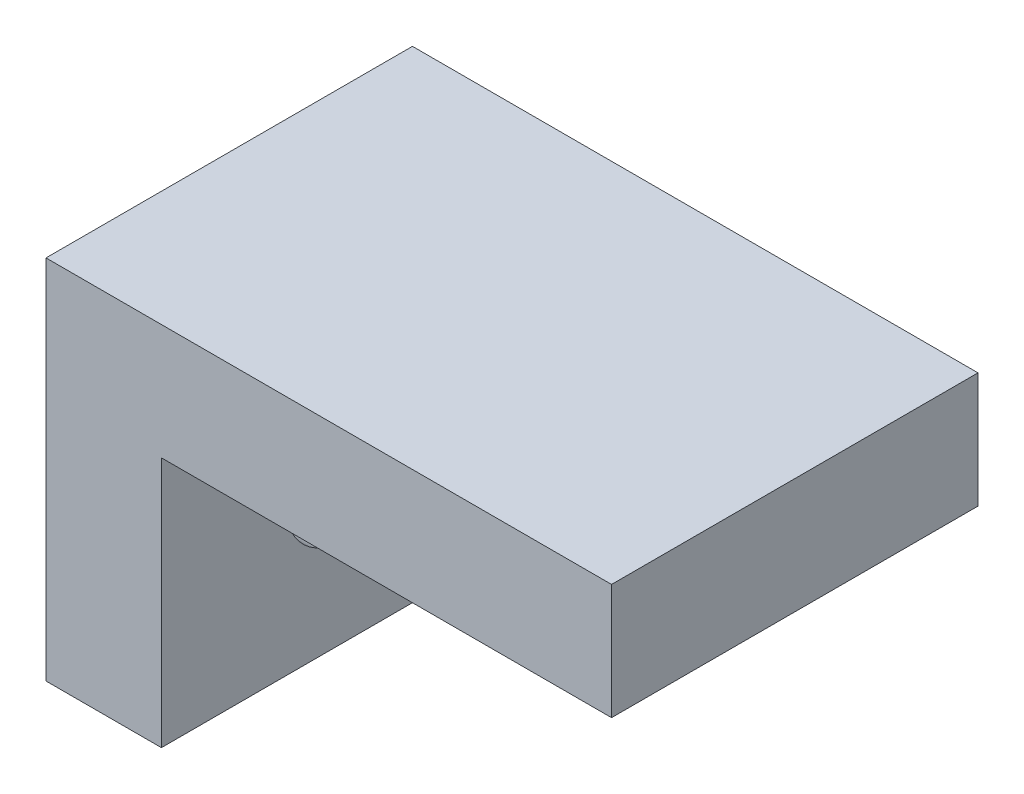
ISO-10303-21;
HEADER;
FILE_DESCRIPTION(('STEP AP214'),'2;1');
FILE_NAME('part.step','',(''),(''),'','','');
FILE_SCHEMA(('AUTOMOTIVE_DESIGN { 1 0 10303 214 1 1 1 1 }'));
ENDSEC;
DATA;
#1=APPLICATION_CONTEXT('core data for automotive mechanical design processes');
#2=APPLICATION_PROTOCOL_DEFINITION('international standard','automotive_design',2000,#1);
#3=PRODUCT_CONTEXT('',#1,'mechanical');
#4=PRODUCT('Part','Part','',(#3));
#5=PRODUCT_RELATED_PRODUCT_CATEGORY('part','',(#4));
#6=PRODUCT_DEFINITION_FORMATION('','',#4);
#7=PRODUCT_DEFINITION_CONTEXT('part definition',#1,'design');
#8=PRODUCT_DEFINITION('design','',#6,#7);
#9=PRODUCT_DEFINITION_SHAPE('','',#8);
#10=(LENGTH_UNIT() NAMED_UNIT(*) SI_UNIT(.MILLI.,.METRE.));
#11=(NAMED_UNIT(*) PLANE_ANGLE_UNIT() SI_UNIT($,.RADIAN.));
#12=(NAMED_UNIT(*) SI_UNIT($,.STERADIAN.) SOLID_ANGLE_UNIT());
#13=UNCERTAINTY_MEASURE_WITH_UNIT(LENGTH_MEASURE(1.E-05),#10,'distance_accuracy_value','');
#14=(GEOMETRIC_REPRESENTATION_CONTEXT(3) GLOBAL_UNCERTAINTY_ASSIGNED_CONTEXT((#13)) GLOBAL_UNIT_ASSIGNED_CONTEXT((#10,
#11,#12)) REPRESENTATION_CONTEXT('',''));
#15=CARTESIAN_POINT('',(0.,0.,0.));
#16=DIRECTION('',(0.,0.,1.));
#17=DIRECTION('',(1.,0.,0.));
#18=AXIS2_PLACEMENT_3D('',#15,#16,#17);
#19=CARTESIAN_POINT('',(2.5,2.9375,7.9375));
#20=DIRECTION('',(0.,1.,0.));
#21=DIRECTION('',(0.,0.,1.));
#22=AXIS2_PLACEMENT_3D('',#19,#20,#21);
#23=PLANE('',#22);
#24=DIRECTION('',(1.,0.,0.));
#25=VECTOR('',#24,1.);
#26=CARTESIAN_POINT('',(2.5,2.9375,-7.9375));
#27=LINE('',#26,#25);
#28=CARTESIAN_POINT('',(2.5,2.9375,-7.9375));
#29=VERTEX_POINT('',#28);
#30=CARTESIAN_POINT('',(22.,2.9375,-7.9375));
#31=VERTEX_POINT('',#30);
#32=EDGE_CURVE('E138',#29,#31,#27,.T.);
#33=ORIENTED_EDGE('',*,*,#32,.T.);
#34=DIRECTION('',(0.,0.,-1.));
#35=VECTOR('',#34,1.);
#36=CARTESIAN_POINT('',(22.,2.9375,7.9375));
#37=LINE('',#36,#35);
#38=CARTESIAN_POINT('',(22.,2.9375,7.9375));
#39=VERTEX_POINT('',#38);
#40=EDGE_CURVE('E13',#39,#31,#37,.T.);
#41=ORIENTED_EDGE('',*,*,#40,.F.);
#42=DIRECTION('',(1.,0.,0.));
#43=VECTOR('',#42,1.);
#44=CARTESIAN_POINT('',(2.5,2.9375,7.9375));
#45=LINE('',#44,#43);
#46=CARTESIAN_POINT('',(2.5,2.9375,7.9375));
#47=VERTEX_POINT('',#46);
#48=EDGE_CURVE('E104',#47,#39,#45,.T.);
#49=ORIENTED_EDGE('',*,*,#48,.F.);
#50=DIRECTION('',(0.,0.,-1.));
#51=VECTOR('',#50,1.);
#52=CARTESIAN_POINT('',(2.5,2.9375,7.9375));
#53=LINE('',#52,#51);
#54=EDGE_CURVE('E72',#47,#29,#53,.T.);
#55=ORIENTED_EDGE('',*,*,#54,.T.);
#56=EDGE_LOOP('',(#33,#41,#49,#55));
#57=FACE_BOUND('',#56,.T.);
#58=ADVANCED_FACE('F56',(#57),#23,.F.);
#59=CARTESIAN_POINT('',(22.,7.93749999999999,7.9375));
#60=DIRECTION('',(1.,0.,0.));
#61=DIRECTION('',(0.,0.,-1.));
#62=AXIS2_PLACEMENT_3D('',#59,#60,#61);
#63=PLANE('',#62);
#64=DIRECTION('',(0.,-1.,0.));
#65=VECTOR('',#64,1.);
#66=CARTESIAN_POINT('',(22.,7.93749999999999,-7.9375));
#67=LINE('',#66,#65);
#68=CARTESIAN_POINT('',(22.,7.93749999999999,-7.9375));
#69=VERTEX_POINT('',#68);
#70=EDGE_CURVE('E140',#69,#31,#67,.T.);
#71=ORIENTED_EDGE('',*,*,#70,.F.);
#72=DIRECTION('',(0.,0.,-1.));
#73=VECTOR('',#72,1.);
#74=CARTESIAN_POINT('',(22.,7.93749999999999,7.9375));
#75=LINE('',#74,#73);
#76=CARTESIAN_POINT('',(22.,7.93749999999999,7.9375));
#77=VERTEX_POINT('',#76);
#78=EDGE_CURVE('E64',#77,#69,#75,.T.);
#79=ORIENTED_EDGE('',*,*,#78,.F.);
#80=DIRECTION('',(0.,-1.,0.));
#81=VECTOR('',#80,1.);
#82=CARTESIAN_POINT('',(22.,7.93749999999999,7.9375));
#83=LINE('',#82,#81);
#84=EDGE_CURVE('E182',#77,#39,#83,.T.);
#85=ORIENTED_EDGE('',*,*,#84,.T.);
#86=ORIENTED_EDGE('',*,*,#40,.T.);
#87=EDGE_LOOP('',(#71,#79,#85,#86));
#88=FACE_BOUND('',#87,.T.);
#89=ADVANCED_FACE('F161',(#88),#63,.T.);
#90=CARTESIAN_POINT('',(-2.5,7.93749999999999,7.9375));
#91=DIRECTION('',(0.,1.,0.));
#92=DIRECTION('',(0.,0.,1.));
#93=AXIS2_PLACEMENT_3D('',#90,#91,#92);
#94=PLANE('',#93);
#95=DIRECTION('',(1.,0.,0.));
#96=VECTOR('',#95,1.);
#97=CARTESIAN_POINT('',(-2.5,7.93749999999999,-7.9375));
#98=LINE('',#97,#96);
#99=CARTESIAN_POINT('',(-2.5,7.93749999999999,-7.9375));
#100=VERTEX_POINT('',#99);
#101=EDGE_CURVE('E144',#100,#69,#98,.T.);
#102=ORIENTED_EDGE('',*,*,#101,.F.);
#103=DIRECTION('',(0.,0.,-1.));
#104=VECTOR('',#103,1.);
#105=CARTESIAN_POINT('',(-2.5,7.93749999999999,7.9375));
#106=LINE('',#105,#104);
#107=CARTESIAN_POINT('',(-2.5,7.93749999999999,7.9375));
#108=VERTEX_POINT('',#107);
#109=EDGE_CURVE('E130',#108,#100,#106,.T.);
#110=ORIENTED_EDGE('',*,*,#109,.F.);
#111=DIRECTION('',(1.,0.,0.));
#112=VECTOR('',#111,1.);
#113=CARTESIAN_POINT('',(2.5,7.93749999999999,7.9375));
#114=LINE('',#113,#112);
#115=EDGE_CURVE('E119',#108,#77,#114,.T.);
#116=ORIENTED_EDGE('',*,*,#115,.T.);
#117=ORIENTED_EDGE('',*,*,#78,.T.);
#118=EDGE_LOOP('',(#102,#110,#116,#117));
#119=FACE_BOUND('',#118,.T.);
#120=ADVANCED_FACE('F158',(#119),#94,.T.);
#121=CARTESIAN_POINT('',(-2.5,7.93749999999999,7.9375));
#122=DIRECTION('',(1.,0.,0.));
#123=DIRECTION('',(0.,1.,0.));
#124=AXIS2_PLACEMENT_3D('',#121,#122,#123);
#125=PLANE('',#124);
#126=CARTESIAN_POINT('',(-2.5,-1.5625,0.));
#127=DIRECTION('',(1.,0.,0.));
#128=DIRECTION('',(0.,1.,0.));
#129=AXIS2_PLACEMENT_3D('',#126,#127,#128);
#130=CIRCLE('',#129,2.55269999999999);
#131=CARTESIAN_POINT('',(-2.5,0.990199999999993,0.));
#132=VERTEX_POINT('',#131);
#133=EDGE_CURVE('E141',#132,#132,#130,.T.);
#134=ORIENTED_EDGE('',*,*,#133,.T.);
#135=EDGE_LOOP('',(#134));
#136=FACE_BOUND('',#135,.T.);
#137=DIRECTION('',(0.,-1.,0.));
#138=VECTOR('',#137,1.);
#139=CARTESIAN_POINT('',(-2.5,7.93749999999999,-7.9375));
#140=LINE('',#139,#138);
#141=CARTESIAN_POINT('',(-2.5,-7.93750000000001,-7.9375));
#142=VERTEX_POINT('',#141);
#143=EDGE_CURVE('E127',#100,#142,#140,.T.);
#144=ORIENTED_EDGE('',*,*,#143,.T.);
#145=DIRECTION('',(0.,0.,-1.));
#146=VECTOR('',#145,1.);
#147=CARTESIAN_POINT('',(-2.5,-7.93750000000001,7.9375));
#148=LINE('',#147,#146);
#149=CARTESIAN_POINT('',(-2.5,-7.93750000000001,7.9375));
#150=VERTEX_POINT('',#149);
#151=EDGE_CURVE('E124',#150,#142,#148,.T.);
#152=ORIENTED_EDGE('',*,*,#151,.F.);
#153=DIRECTION('',(0.,-1.,0.));
#154=VECTOR('',#153,1.);
#155=CARTESIAN_POINT('',(-2.5,7.93749999999999,7.9375));
#156=LINE('',#155,#154);
#157=EDGE_CURVE('E113',#108,#150,#156,.T.);
#158=ORIENTED_EDGE('',*,*,#157,.F.);
#159=ORIENTED_EDGE('',*,*,#109,.T.);
#160=EDGE_LOOP('',(#144,#152,#158,#159));
#161=FACE_BOUND('',#160,.T.);
#162=ADVANCED_FACE('F125',(#136,#161),#125,.F.);
#163=CARTESIAN_POINT('',(-2.5,-7.93750000000001,7.9375));
#164=DIRECTION('',(0.,1.,0.));
#165=DIRECTION('',(0.,0.,1.));
#166=AXIS2_PLACEMENT_3D('',#163,#164,#165);
#167=PLANE('',#166);
#168=DIRECTION('',(1.,0.,0.));
#169=VECTOR('',#168,1.);
#170=CARTESIAN_POINT('',(-2.5,-7.93750000000001,-7.9375));
#171=LINE('',#170,#169);
#172=CARTESIAN_POINT('',(2.5,-7.93750000000001,-7.9375));
#173=VERTEX_POINT('',#172);
#174=EDGE_CURVE('E147',#142,#173,#171,.T.);
#175=ORIENTED_EDGE('',*,*,#174,.T.);
#176=DIRECTION('',(0.,0.,-1.));
#177=VECTOR('',#176,1.);
#178=CARTESIAN_POINT('',(2.5,-7.93750000000001,7.9375));
#179=LINE('',#178,#177);
#180=CARTESIAN_POINT('',(2.5,-7.93750000000001,7.9375));
#181=VERTEX_POINT('',#180);
#182=EDGE_CURVE('E92',#181,#173,#179,.T.);
#183=ORIENTED_EDGE('',*,*,#182,.F.);
#184=DIRECTION('',(1.,0.,0.));
#185=VECTOR('',#184,1.);
#186=CARTESIAN_POINT('',(-2.5,-7.93750000000001,7.9375));
#187=LINE('',#186,#185);
#188=EDGE_CURVE('E117',#150,#181,#187,.T.);
#189=ORIENTED_EDGE('',*,*,#188,.F.);
#190=ORIENTED_EDGE('',*,*,#151,.T.);
#191=EDGE_LOOP('',(#175,#183,#189,#190));
#192=FACE_BOUND('',#191,.T.);
#193=ADVANCED_FACE('F132',(#192),#167,.F.);
#194=CARTESIAN_POINT('',(2.5,2.9375,7.9375));
#195=DIRECTION('',(1.,0.,0.));
#196=DIRECTION('',(0.,1.,0.));
#197=AXIS2_PLACEMENT_3D('',#194,#195,#196);
#198=PLANE('',#197);
#199=CARTESIAN_POINT('',(2.5,-1.5625,0.));
#200=DIRECTION('',(1.,0.,0.));
#201=DIRECTION('',(0.,0.,-1.));
#202=AXIS2_PLACEMENT_3D('',#199,#200,#201);
#203=CIRCLE('',#202,2.55269999999999);
#204=CARTESIAN_POINT('',(2.5,-1.5625,-2.55269999999999));
#205=VERTEX_POINT('',#204);
#206=EDGE_CURVE('E188',#205,#205,#203,.T.);
#207=ORIENTED_EDGE('',*,*,#206,.F.);
#208=EDGE_LOOP('',(#207));
#209=FACE_BOUND('',#208,.T.);
#210=DIRECTION('',(0.,-1.,0.));
#211=VECTOR('',#210,1.);
#212=CARTESIAN_POINT('',(2.5,2.9375,-7.9375));
#213=LINE('',#212,#211);
#214=EDGE_CURVE('E149',#29,#173,#213,.T.);
#215=ORIENTED_EDGE('',*,*,#214,.F.);
#216=ORIENTED_EDGE('',*,*,#54,.F.);
#217=DIRECTION('',(0.,-1.,0.));
#218=VECTOR('',#217,1.);
#219=CARTESIAN_POINT('',(2.5,2.9375,7.9375));
#220=LINE('',#219,#218);
#221=EDGE_CURVE('E133',#47,#181,#220,.T.);
#222=ORIENTED_EDGE('',*,*,#221,.T.);
#223=ORIENTED_EDGE('',*,*,#182,.T.);
#224=EDGE_LOOP('',(#215,#216,#222,#223));
#225=FACE_BOUND('',#224,.T.);
#226=ADVANCED_FACE('F164',(#209,#225),#198,.T.);
#227=CARTESIAN_POINT('',(0.,0.,7.9375));
#228=DIRECTION('',(0.,0.,-1.));
#229=DIRECTION('',(-1.,0.,0.));
#230=AXIS2_PLACEMENT_3D('',#227,#228,#229);
#231=PLANE('',#230);
#232=ORIENTED_EDGE('',*,*,#48,.T.);
#233=ORIENTED_EDGE('',*,*,#84,.F.);
#234=ORIENTED_EDGE('',*,*,#115,.F.);
#235=ORIENTED_EDGE('',*,*,#157,.T.);
#236=ORIENTED_EDGE('',*,*,#188,.T.);
#237=ORIENTED_EDGE('',*,*,#221,.F.);
#238=EDGE_LOOP('',(#232,#233,#234,#235,#236,#237));
#239=FACE_BOUND('',#238,.T.);
#240=ADVANCED_FACE('F115',(#239),#231,.F.);
#241=CARTESIAN_POINT('',(0.,0.,-7.9375));
#242=DIRECTION('',(0.,0.,-1.));
#243=DIRECTION('',(-1.,0.,0.));
#244=AXIS2_PLACEMENT_3D('',#241,#242,#243);
#245=PLANE('',#244);
#246=ORIENTED_EDGE('',*,*,#32,.F.);
#247=ORIENTED_EDGE('',*,*,#214,.T.);
#248=ORIENTED_EDGE('',*,*,#174,.F.);
#249=ORIENTED_EDGE('',*,*,#143,.F.);
#250=ORIENTED_EDGE('',*,*,#101,.T.);
#251=ORIENTED_EDGE('',*,*,#70,.T.);
#252=EDGE_LOOP('',(#246,#247,#248,#249,#250,#251));
#253=FACE_BOUND('',#252,.T.);
#254=ADVANCED_FACE('F163',(#253),#245,.T.);
#255=CARTESIAN_POINT('',(2.5,-1.5625,0.));
#256=DIRECTION('',(1.,0.,0.));
#257=DIRECTION('',(0.,0.,-1.));
#258=AXIS2_PLACEMENT_3D('',#255,#256,#257);
#259=CYLINDRICAL_SURFACE('',#258,2.55269999999999);
#260=ORIENTED_EDGE('',*,*,#133,.F.);
#261=EDGE_LOOP('',(#260));
#262=FACE_BOUND('',#261,.T.);
#263=ORIENTED_EDGE('',*,*,#206,.T.);
#264=EDGE_LOOP('',(#263));
#265=FACE_BOUND('',#264,.T.);
#266=ADVANCED_FACE('F191',(#262,#265),#259,.F.);
#267=CLOSED_SHELL('',(#58,#89,#120,#162,#193,#226,#240,#254,#266));
#268=MANIFOLD_SOLID_BREP('B2',#267);
#269=ADVANCED_BREP_SHAPE_REPRESENTATION('',(#18,#268),#14);
#270=SHAPE_DEFINITION_REPRESENTATION(#9,#269);
ENDSEC;
END-ISO-10303-21;
